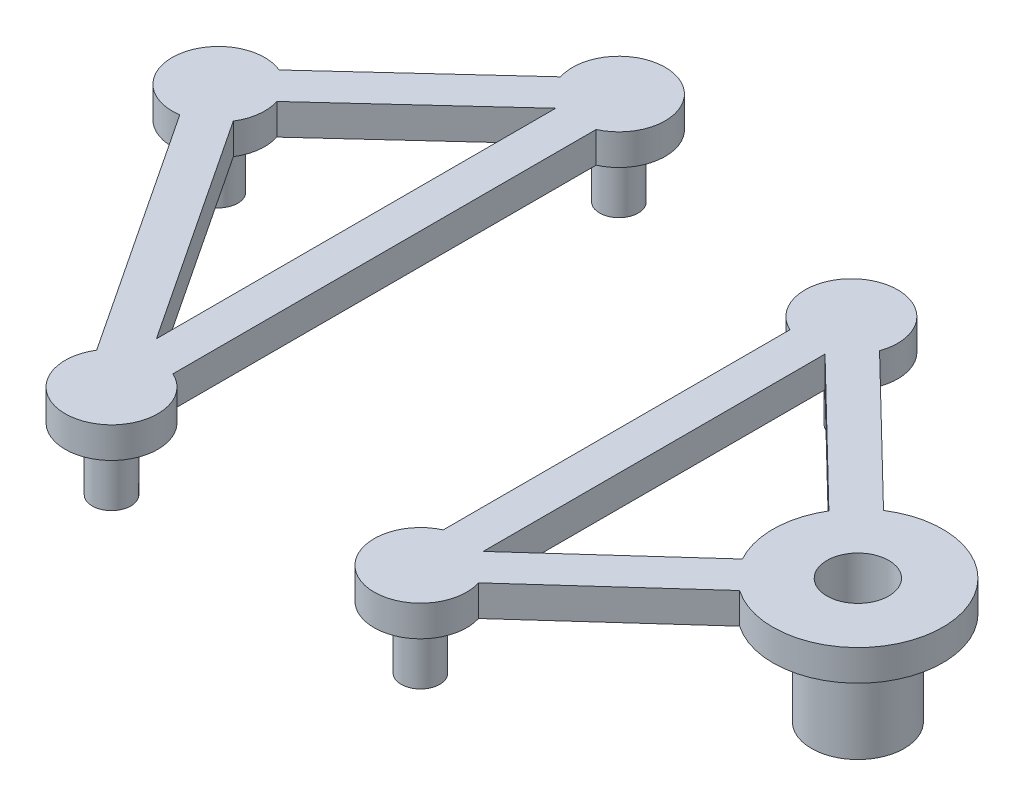
ISO-10303-21;
HEADER;
FILE_DESCRIPTION(('STEP AP214'),'2;1');
FILE_NAME('part.step','',(''),(''),'','','');
FILE_SCHEMA(('AUTOMOTIVE_DESIGN { 1 0 10303 214 1 1 1 1 }'));
ENDSEC;
DATA;
#1=APPLICATION_CONTEXT('core data for automotive mechanical design processes');
#2=APPLICATION_PROTOCOL_DEFINITION('international standard','automotive_design',2000,#1);
#3=PRODUCT_CONTEXT('',#1,'mechanical');
#4=PRODUCT('Part','Part','',(#3));
#5=PRODUCT_RELATED_PRODUCT_CATEGORY('part','',(#4));
#6=PRODUCT_DEFINITION_FORMATION('','',#4);
#7=PRODUCT_DEFINITION_CONTEXT('part definition',#1,'design');
#8=PRODUCT_DEFINITION('design','',#6,#7);
#9=PRODUCT_DEFINITION_SHAPE('','',#8);
#10=(LENGTH_UNIT() NAMED_UNIT(*) SI_UNIT(.MILLI.,.METRE.));
#11=(NAMED_UNIT(*) PLANE_ANGLE_UNIT() SI_UNIT($,.RADIAN.));
#12=(NAMED_UNIT(*) SI_UNIT($,.STERADIAN.) SOLID_ANGLE_UNIT());
#13=UNCERTAINTY_MEASURE_WITH_UNIT(LENGTH_MEASURE(1.E-05),#10,'distance_accuracy_value','');
#14=(GEOMETRIC_REPRESENTATION_CONTEXT(3) GLOBAL_UNCERTAINTY_ASSIGNED_CONTEXT((#13)) GLOBAL_UNIT_ASSIGNED_CONTEXT((#10,
#11,#12)) REPRESENTATION_CONTEXT('',''));
#15=CARTESIAN_POINT('',(0.,0.,0.));
#16=DIRECTION('',(0.,0.,1.));
#17=DIRECTION('',(1.,0.,0.));
#18=AXIS2_PLACEMENT_3D('',#15,#16,#17);
#19=CARTESIAN_POINT('',(0.,4.,0.));
#20=DIRECTION('',(0.,1.,0.));
#21=DIRECTION('',(0.,0.,1.));
#22=AXIS2_PLACEMENT_3D('',#19,#20,#21);
#23=PLANE('',#22);
#24=CARTESIAN_POINT('',(29.7602440945933,4.,-26.8763440860215));
#25=DIRECTION('',(0.,1.,0.));
#26=DIRECTION('',(0.,0.,1.));
#27=AXIS2_PLACEMENT_3D('',#24,#25,#26);
#28=CIRCLE('',#27,4.);
#29=CARTESIAN_POINT('',(29.7602440945933,4.,-22.8763440860215));
#30=VERTEX_POINT('',#29);
#31=EDGE_CURVE('E237',#30,#30,#28,.T.);
#32=ORIENTED_EDGE('',*,*,#31,.F.);
#33=EDGE_LOOP('',(#32));
#34=FACE_BOUND('',#33,.T.);
#35=CARTESIAN_POINT('',(0.,4.,0.));
#36=DIRECTION('',(0.,1.,0.));
#37=DIRECTION('',(0.,0.,1.));
#38=AXIS2_PLACEMENT_3D('',#35,#36,#37);
#39=CIRCLE('',#38,6.);
#40=CARTESIAN_POINT('',(-2.49999999999999,4.,-5.45435605731786));
#41=VERTEX_POINT('',#40);
#42=CARTESIAN_POINT('',(5.72353685435553,4.,-1.80031271640067));
#43=VERTEX_POINT('',#42);
#44=EDGE_CURVE('E185',#41,#43,#39,.T.);
#45=ORIENTED_EDGE('',*,*,#44,.T.);
#46=DIRECTION('',(0.742150725550956,0.,-0.670233019601534));
#47=VECTOR('',#46,1.);
#48=CARTESIAN_POINT('',(5.72353685435553,4.,-1.80031271640067));
#49=LINE('',#48,#47);
#50=CARTESIAN_POINT('',(23.4858022090272,4.,-17.8413355622484));
#51=VERTEX_POINT('',#50);
#52=EDGE_CURVE('E189',#43,#51,#49,.T.);
#53=ORIENTED_EDGE('',*,*,#52,.T.);
#54=CARTESIAN_POINT('',(29.7602440945933,4.,-26.8763440860215));
#55=DIRECTION('',(0.,1.,0.));
#56=DIRECTION('',(0.,0.,1.));
#57=AXIS2_PLACEMENT_3D('',#54,#55,#56);
#58=CIRCLE('',#57,11.);
#59=CARTESIAN_POINT('',(23.8208021658871,4.,-36.1350172941829));
#60=VERTEX_POINT('',#59);
#61=EDGE_CURVE('E191',#51,#60,#58,.T.);
#62=ORIENTED_EDGE('',*,*,#61,.T.);
#63=DIRECTION('',(-0.71711431553237,0.,-0.696955564192252));
#64=VECTOR('',#63,1.);
#65=CARTESIAN_POINT('',(5.65378572119396,4.,-53.7913419855975));
#66=LINE('',#65,#64);
#67=CARTESIAN_POINT('',(5.65378572119396,4.,-53.7913419855975));
#68=VERTEX_POINT('',#67);
#69=EDGE_CURVE('E193',#60,#68,#66,.T.);
#70=ORIENTED_EDGE('',*,*,#69,.T.);
#71=CARTESIAN_POINT('',(0.,4.,-55.8));
#72=DIRECTION('',(0.,1.,0.));
#73=DIRECTION('',(0.,0.,1.));
#74=AXIS2_PLACEMENT_3D('',#71,#72,#73);
#75=CIRCLE('',#74,6.);
#76=CARTESIAN_POINT('',(-2.5,4.,-50.3456439426821));
#77=VERTEX_POINT('',#76);
#78=EDGE_CURVE('E195',#68,#77,#75,.T.);
#79=ORIENTED_EDGE('',*,*,#78,.T.);
#80=DIRECTION('',(0.,0.,1.));
#81=VECTOR('',#80,1.);
#82=CARTESIAN_POINT('',(-2.5,4.,-50.3456439426821));
#83=LINE('',#82,#81);
#84=EDGE_CURVE('E197',#77,#41,#83,.T.);
#85=ORIENTED_EDGE('',*,*,#84,.T.);
#86=EDGE_LOOP('',(#45,#53,#62,#70,#79,#85));
#87=FACE_BOUND('',#86,.T.);
#88=DIRECTION('',(-0.717114315532369,0.,-0.696955564192253));
#89=VECTOR('',#88,1.);
#90=CARTESIAN_POINT('',(2.50000000000001,4.,-49.8840828043836));
#91=LINE('',#90,#89);
#92=CARTESIAN_POINT('',(20.3360243449258,4.,-32.5494457165211));
#93=VERTEX_POINT('',#92);
#94=CARTESIAN_POINT('',(2.50000000000001,4.,-49.8840828043836));
#95=VERTEX_POINT('',#94);
#96=EDGE_CURVE('E80',#93,#95,#91,.T.);
#97=ORIENTED_EDGE('',*,*,#96,.F.);
#98=CARTESIAN_POINT('',(29.7602440945933,4.,-26.8763440860215));
#99=DIRECTION('',(0.,-1.,0.));
#100=DIRECTION('',(0.,0.,1.));
#101=AXIS2_PLACEMENT_3D('',#98,#99,#100);
#102=CIRCLE('',#101,11.);
#103=CARTESIAN_POINT('',(20.1346371110196,4.,-21.5520891900031));
#104=VERTEX_POINT('',#103);
#105=EDGE_CURVE('E86',#104,#93,#102,.T.);
#106=ORIENTED_EDGE('',*,*,#105,.F.);
#107=DIRECTION('',(0.742150725550956,0.,-0.670233019601534));
#108=VECTOR('',#107,1.);
#109=CARTESIAN_POINT('',(20.1346371110196,4.,-21.5520891900031));
#110=LINE('',#109,#108);
#111=CARTESIAN_POINT('',(2.50000000000001,4.,-5.62632684338344));
#112=VERTEX_POINT('',#111);
#113=EDGE_CURVE('E137',#112,#104,#110,.T.);
#114=ORIENTED_EDGE('',*,*,#113,.F.);
#115=DIRECTION('',(0.,0.,1.));
#116=VECTOR('',#115,1.);
#117=CARTESIAN_POINT('',(2.50000000000001,4.,-5.62632684338344));
#118=LINE('',#117,#116);
#119=EDGE_CURVE('E145',#95,#112,#118,.T.);
#120=ORIENTED_EDGE('',*,*,#119,.F.);
#121=EDGE_LOOP('',(#97,#106,#114,#120));
#122=FACE_BOUND('',#121,.T.);
#123=ADVANCED_FACE('F51',(#34,#87,#122),#23,.T.);
#124=CARTESIAN_POINT('',(0.,0.,0.));
#125=DIRECTION('',(0.,1.,0.));
#126=DIRECTION('',(0.,0.,1.));
#127=AXIS2_PLACEMENT_3D('',#124,#125,#126);
#128=PLANE('',#127);
#129=CARTESIAN_POINT('',(29.7602440945933,0.,-26.8763440860215));
#130=DIRECTION('',(0.,1.,0.));
#131=DIRECTION('',(0.,0.,1.));
#132=AXIS2_PLACEMENT_3D('',#129,#130,#131);
#133=CIRCLE('',#132,6.);
#134=CARTESIAN_POINT('',(29.7602440945933,0.,-20.8763440860215));
#135=VERTEX_POINT('',#134);
#136=EDGE_CURVE('E12',#135,#135,#133,.F.);
#137=ORIENTED_EDGE('',*,*,#136,.F.);
#138=EDGE_LOOP('',(#137));
#139=FACE_BOUND('',#138,.T.);
#140=CARTESIAN_POINT('',(0.,0.,0.));
#141=DIRECTION('',(0.,1.,0.));
#142=DIRECTION('',(0.,0.,1.));
#143=AXIS2_PLACEMENT_3D('',#140,#141,#142);
#144=CIRCLE('',#143,2.5);
#145=CARTESIAN_POINT('',(0.,0.,2.5));
#146=VERTEX_POINT('',#145);
#147=EDGE_CURVE('E60',#146,#146,#144,.F.);
#148=ORIENTED_EDGE('',*,*,#147,.F.);
#149=EDGE_LOOP('',(#148));
#150=FACE_BOUND('',#149,.T.);
#151=CARTESIAN_POINT('',(0.,0.,-55.8));
#152=DIRECTION('',(0.,1.,0.));
#153=DIRECTION('',(0.,0.,1.));
#154=AXIS2_PLACEMENT_3D('',#151,#152,#153);
#155=CIRCLE('',#154,2.5);
#156=CARTESIAN_POINT('',(0.,0.,-53.3));
#157=VERTEX_POINT('',#156);
#158=EDGE_CURVE('E157',#157,#157,#155,.F.);
#159=ORIENTED_EDGE('',*,*,#158,.F.);
#160=EDGE_LOOP('',(#159));
#161=FACE_BOUND('',#160,.T.);
#162=CARTESIAN_POINT('',(0.,0.,0.));
#163=DIRECTION('',(0.,1.,0.));
#164=DIRECTION('',(0.,0.,1.));
#165=AXIS2_PLACEMENT_3D('',#162,#163,#164);
#166=CIRCLE('',#165,6.);
#167=CARTESIAN_POINT('',(-2.49999999999999,0.,-5.45435605731786));
#168=VERTEX_POINT('',#167);
#169=CARTESIAN_POINT('',(5.72353685435553,0.,-1.80031271640067));
#170=VERTEX_POINT('',#169);
#171=EDGE_CURVE('E176',#168,#170,#166,.T.);
#172=ORIENTED_EDGE('',*,*,#171,.F.);
#173=DIRECTION('',(0.,0.,1.));
#174=VECTOR('',#173,1.);
#175=CARTESIAN_POINT('',(-2.5,0.,-50.3456439426821));
#176=LINE('',#175,#174);
#177=CARTESIAN_POINT('',(-2.5,0.,-50.3456439426821));
#178=VERTEX_POINT('',#177);
#179=EDGE_CURVE('E188',#178,#168,#176,.T.);
#180=ORIENTED_EDGE('',*,*,#179,.F.);
#181=CARTESIAN_POINT('',(0.,0.,-55.8));
#182=DIRECTION('',(0.,1.,0.));
#183=DIRECTION('',(0.,0.,1.));
#184=AXIS2_PLACEMENT_3D('',#181,#182,#183);
#185=CIRCLE('',#184,6.);
#186=CARTESIAN_POINT('',(5.65378572119396,0.,-53.7913419855975));
#187=VERTEX_POINT('',#186);
#188=EDGE_CURVE('E207',#187,#178,#185,.T.);
#189=ORIENTED_EDGE('',*,*,#188,.F.);
#190=DIRECTION('',(-0.71711431553237,0.,-0.696955564192252));
#191=VECTOR('',#190,1.);
#192=CARTESIAN_POINT('',(5.65378572119396,0.,-53.7913419855975));
#193=LINE('',#192,#191);
#194=CARTESIAN_POINT('',(23.8208021658871,0.,-36.1350172941829));
#195=VERTEX_POINT('',#194);
#196=EDGE_CURVE('E205',#195,#187,#193,.T.);
#197=ORIENTED_EDGE('',*,*,#196,.F.);
#198=CARTESIAN_POINT('',(29.7602440945933,0.,-26.8763440860215));
#199=DIRECTION('',(0.,1.,0.));
#200=DIRECTION('',(0.,0.,1.));
#201=AXIS2_PLACEMENT_3D('',#198,#199,#200);
#202=CIRCLE('',#201,11.);
#203=CARTESIAN_POINT('',(23.4858022090272,0.,-17.8413355622484));
#204=VERTEX_POINT('',#203);
#205=EDGE_CURVE('E203',#204,#195,#202,.T.);
#206=ORIENTED_EDGE('',*,*,#205,.F.);
#207=DIRECTION('',(0.742150725550956,0.,-0.670233019601534));
#208=VECTOR('',#207,1.);
#209=CARTESIAN_POINT('',(5.72353685435553,0.,-1.80031271640067));
#210=LINE('',#209,#208);
#211=EDGE_CURVE('E201',#170,#204,#210,.T.);
#212=ORIENTED_EDGE('',*,*,#211,.F.);
#213=EDGE_LOOP('',(#172,#180,#189,#197,#206,#212));
#214=FACE_BOUND('',#213,.T.);
#215=CARTESIAN_POINT('',(29.7602440945933,0.,-26.8763440860215));
#216=DIRECTION('',(0.,-1.,0.));
#217=DIRECTION('',(0.,0.,1.));
#218=AXIS2_PLACEMENT_3D('',#215,#216,#217);
#219=CIRCLE('',#218,11.);
#220=CARTESIAN_POINT('',(20.1346371110196,0.,-21.5520891900031));
#221=VERTEX_POINT('',#220);
#222=CARTESIAN_POINT('',(20.3360243449258,0.,-32.5494457165211));
#223=VERTEX_POINT('',#222);
#224=EDGE_CURVE('E152',#221,#223,#219,.T.);
#225=ORIENTED_EDGE('',*,*,#224,.T.);
#226=DIRECTION('',(-0.717114315532369,0.,-0.696955564192253));
#227=VECTOR('',#226,1.);
#228=CARTESIAN_POINT('',(2.50000000000001,0.,-49.8840828043836));
#229=LINE('',#228,#227);
#230=CARTESIAN_POINT('',(2.50000000000001,0.,-49.8840828043836));
#231=VERTEX_POINT('',#230);
#232=EDGE_CURVE('E68',#223,#231,#229,.T.);
#233=ORIENTED_EDGE('',*,*,#232,.T.);
#234=DIRECTION('',(0.,0.,1.));
#235=VECTOR('',#234,1.);
#236=CARTESIAN_POINT('',(2.50000000000001,0.,-5.62632684338344));
#237=LINE('',#236,#235);
#238=CARTESIAN_POINT('',(2.50000000000001,0.,-5.62632684338344));
#239=VERTEX_POINT('',#238);
#240=EDGE_CURVE('E178',#231,#239,#237,.T.);
#241=ORIENTED_EDGE('',*,*,#240,.T.);
#242=DIRECTION('',(0.742150725550956,0.,-0.670233019601534));
#243=VECTOR('',#242,1.);
#244=CARTESIAN_POINT('',(20.1346371110196,0.,-21.5520891900031));
#245=LINE('',#244,#243);
#246=EDGE_CURVE('E139',#239,#221,#245,.T.);
#247=ORIENTED_EDGE('',*,*,#246,.T.);
#248=EDGE_LOOP('',(#225,#233,#241,#247));
#249=FACE_BOUND('',#248,.T.);
#250=ADVANCED_FACE('F164',(#139,#150,#161,#214,#249),#128,.F.);
#251=CARTESIAN_POINT('',(0.,4.,0.));
#252=DIRECTION('',(0.,-1.,0.));
#253=DIRECTION('',(0.,0.,-1.));
#254=AXIS2_PLACEMENT_3D('',#251,#252,#253);
#255=CYLINDRICAL_SURFACE('',#254,6.);
#256=ORIENTED_EDGE('',*,*,#171,.T.);
#257=DIRECTION('',(0.,-1.,0.));
#258=VECTOR('',#257,1.);
#259=CARTESIAN_POINT('',(5.72353685435553,4.,-1.80031271640067));
#260=LINE('',#259,#258);
#261=EDGE_CURVE('E224',#43,#170,#260,.T.);
#262=ORIENTED_EDGE('',*,*,#261,.F.);
#263=ORIENTED_EDGE('',*,*,#44,.F.);
#264=DIRECTION('',(0.,-1.,0.));
#265=VECTOR('',#264,1.);
#266=CARTESIAN_POINT('',(-2.49999999999999,4.,-5.45435605731786));
#267=LINE('',#266,#265);
#268=EDGE_CURVE('E199',#41,#168,#267,.T.);
#269=ORIENTED_EDGE('',*,*,#268,.T.);
#270=EDGE_LOOP('',(#256,#262,#263,#269));
#271=FACE_BOUND('',#270,.T.);
#272=ADVANCED_FACE('F167',(#271),#255,.T.);
#273=CARTESIAN_POINT('',(5.72353685435553,4.,-1.80031271640067));
#274=DIRECTION('',(-0.670233019601534,0.,-0.742150725550956));
#275=DIRECTION('',(-0.742150725550956,0.,0.670233019601534));
#276=AXIS2_PLACEMENT_3D('',#273,#274,#275);
#277=PLANE('',#276);
#278=ORIENTED_EDGE('',*,*,#211,.T.);
#279=DIRECTION('',(0.,-1.,0.));
#280=VECTOR('',#279,1.);
#281=CARTESIAN_POINT('',(23.4858022090272,4.,-17.8413355622484));
#282=LINE('',#281,#280);
#283=EDGE_CURVE('E221',#51,#204,#282,.T.);
#284=ORIENTED_EDGE('',*,*,#283,.F.);
#285=ORIENTED_EDGE('',*,*,#52,.F.);
#286=ORIENTED_EDGE('',*,*,#261,.T.);
#287=EDGE_LOOP('',(#278,#284,#285,#286));
#288=FACE_BOUND('',#287,.T.);
#289=ADVANCED_FACE('F262',(#288),#277,.F.);
#290=CARTESIAN_POINT('',(29.7602440945933,4.,-26.8763440860215));
#291=DIRECTION('',(0.,-1.,0.));
#292=DIRECTION('',(0.,0.,-1.));
#293=AXIS2_PLACEMENT_3D('',#290,#291,#292);
#294=CYLINDRICAL_SURFACE('',#293,11.);
#295=ORIENTED_EDGE('',*,*,#205,.T.);
#296=DIRECTION('',(0.,-1.,0.));
#297=VECTOR('',#296,1.);
#298=CARTESIAN_POINT('',(23.8208021658871,4.,-36.1350172941829));
#299=LINE('',#298,#297);
#300=EDGE_CURVE('E218',#60,#195,#299,.T.);
#301=ORIENTED_EDGE('',*,*,#300,.F.);
#302=ORIENTED_EDGE('',*,*,#61,.F.);
#303=ORIENTED_EDGE('',*,*,#283,.T.);
#304=EDGE_LOOP('',(#295,#301,#302,#303));
#305=FACE_BOUND('',#304,.T.);
#306=ADVANCED_FACE('F267',(#305),#294,.T.);
#307=CARTESIAN_POINT('',(5.65378572119396,4.,-53.7913419855975));
#308=DIRECTION('',(-0.696955564192252,0.,0.71711431553237));
#309=DIRECTION('',(0.71711431553237,0.,0.696955564192252));
#310=AXIS2_PLACEMENT_3D('',#307,#308,#309);
#311=PLANE('',#310);
#312=ORIENTED_EDGE('',*,*,#196,.T.);
#313=DIRECTION('',(0.,-1.,0.));
#314=VECTOR('',#313,1.);
#315=CARTESIAN_POINT('',(5.65378572119396,4.,-53.7913419855975));
#316=LINE('',#315,#314);
#317=EDGE_CURVE('E215',#68,#187,#316,.T.);
#318=ORIENTED_EDGE('',*,*,#317,.F.);
#319=ORIENTED_EDGE('',*,*,#69,.F.);
#320=ORIENTED_EDGE('',*,*,#300,.T.);
#321=EDGE_LOOP('',(#312,#318,#319,#320));
#322=FACE_BOUND('',#321,.T.);
#323=ADVANCED_FACE('F273',(#322),#311,.F.);
#324=CARTESIAN_POINT('',(0.,4.,-55.8));
#325=DIRECTION('',(0.,-1.,0.));
#326=DIRECTION('',(0.,0.,-1.));
#327=AXIS2_PLACEMENT_3D('',#324,#325,#326);
#328=CYLINDRICAL_SURFACE('',#327,6.);
#329=ORIENTED_EDGE('',*,*,#188,.T.);
#330=DIRECTION('',(0.,-1.,0.));
#331=VECTOR('',#330,1.);
#332=CARTESIAN_POINT('',(-2.5,4.,-50.3456439426821));
#333=LINE('',#332,#331);
#334=EDGE_CURVE('E212',#77,#178,#333,.T.);
#335=ORIENTED_EDGE('',*,*,#334,.F.);
#336=ORIENTED_EDGE('',*,*,#78,.F.);
#337=ORIENTED_EDGE('',*,*,#317,.T.);
#338=EDGE_LOOP('',(#329,#335,#336,#337));
#339=FACE_BOUND('',#338,.T.);
#340=ADVANCED_FACE('F277',(#339),#328,.T.);
#341=CARTESIAN_POINT('',(-2.5,4.,-50.3456439426821));
#342=DIRECTION('',(1.,0.,0.));
#343=DIRECTION('',(0.,0.,-1.));
#344=AXIS2_PLACEMENT_3D('',#341,#342,#343);
#345=PLANE('',#344);
#346=ORIENTED_EDGE('',*,*,#179,.T.);
#347=ORIENTED_EDGE('',*,*,#268,.F.);
#348=ORIENTED_EDGE('',*,*,#84,.F.);
#349=ORIENTED_EDGE('',*,*,#334,.T.);
#350=EDGE_LOOP('',(#346,#347,#348,#349));
#351=FACE_BOUND('',#350,.T.);
#352=ADVANCED_FACE('F279',(#351),#345,.F.);
#353=CARTESIAN_POINT('',(29.7602440945933,4.,-26.8763440860215));
#354=DIRECTION('',(0.,-1.,0.));
#355=DIRECTION('',(0.,0.,-1.));
#356=AXIS2_PLACEMENT_3D('',#353,#354,#355);
#357=CYLINDRICAL_SURFACE('',#356,11.);
#358=ORIENTED_EDGE('',*,*,#224,.F.);
#359=DIRECTION('',(0.,-1.,0.));
#360=VECTOR('',#359,1.);
#361=CARTESIAN_POINT('',(20.1346371110196,4.,-21.5520891900031));
#362=LINE('',#361,#360);
#363=EDGE_CURVE('E141',#104,#221,#362,.T.);
#364=ORIENTED_EDGE('',*,*,#363,.F.);
#365=ORIENTED_EDGE('',*,*,#105,.T.);
#366=DIRECTION('',(0.,-1.,0.));
#367=VECTOR('',#366,1.);
#368=CARTESIAN_POINT('',(20.3360243449258,4.,-32.5494457165211));
#369=LINE('',#368,#367);
#370=EDGE_CURVE('E183',#93,#223,#369,.T.);
#371=ORIENTED_EDGE('',*,*,#370,.T.);
#372=EDGE_LOOP('',(#358,#364,#365,#371));
#373=FACE_BOUND('',#372,.T.);
#374=ADVANCED_FACE('F281',(#373),#357,.T.);
#375=CARTESIAN_POINT('',(2.50000000000001,4.,-49.8840828043836));
#376=DIRECTION('',(-0.696955564192253,0.,0.717114315532369));
#377=DIRECTION('',(0.717114315532369,0.,0.696955564192253));
#378=AXIS2_PLACEMENT_3D('',#375,#376,#377);
#379=PLANE('',#378);
#380=ORIENTED_EDGE('',*,*,#232,.F.);
#381=ORIENTED_EDGE('',*,*,#370,.F.);
#382=ORIENTED_EDGE('',*,*,#96,.T.);
#383=DIRECTION('',(0.,-1.,0.));
#384=VECTOR('',#383,1.);
#385=CARTESIAN_POINT('',(2.50000000000001,4.,-49.8840828043836));
#386=LINE('',#385,#384);
#387=EDGE_CURVE('E142',#95,#231,#386,.T.);
#388=ORIENTED_EDGE('',*,*,#387,.T.);
#389=EDGE_LOOP('',(#380,#381,#382,#388));
#390=FACE_BOUND('',#389,.T.);
#391=ADVANCED_FACE('F287',(#390),#379,.T.);
#392=CARTESIAN_POINT('',(2.50000000000001,4.,-5.62632684338344));
#393=DIRECTION('',(1.,0.,0.));
#394=DIRECTION('',(0.,0.,-1.));
#395=AXIS2_PLACEMENT_3D('',#392,#393,#394);
#396=PLANE('',#395);
#397=ORIENTED_EDGE('',*,*,#240,.F.);
#398=ORIENTED_EDGE('',*,*,#387,.F.);
#399=ORIENTED_EDGE('',*,*,#119,.T.);
#400=DIRECTION('',(0.,-1.,0.));
#401=VECTOR('',#400,1.);
#402=CARTESIAN_POINT('',(2.50000000000001,4.,-5.62632684338344));
#403=LINE('',#402,#401);
#404=EDGE_CURVE('E92',#112,#239,#403,.T.);
#405=ORIENTED_EDGE('',*,*,#404,.T.);
#406=EDGE_LOOP('',(#397,#398,#399,#405));
#407=FACE_BOUND('',#406,.T.);
#408=ADVANCED_FACE('F146',(#407),#396,.T.);
#409=CARTESIAN_POINT('',(20.1346371110196,4.,-21.5520891900031));
#410=DIRECTION('',(-0.670233019601534,0.,-0.742150725550956));
#411=DIRECTION('',(-0.742150725550956,0.,0.670233019601534));
#412=AXIS2_PLACEMENT_3D('',#409,#410,#411);
#413=PLANE('',#412);
#414=ORIENTED_EDGE('',*,*,#246,.F.);
#415=ORIENTED_EDGE('',*,*,#404,.F.);
#416=ORIENTED_EDGE('',*,*,#113,.T.);
#417=ORIENTED_EDGE('',*,*,#363,.T.);
#418=EDGE_LOOP('',(#414,#415,#416,#417));
#419=FACE_BOUND('',#418,.T.);
#420=ADVANCED_FACE('F53',(#419),#413,.T.);
#421=CARTESIAN_POINT('',(0.,-8.1,-55.8));
#422=DIRECTION('',(0.,1.,0.));
#423=DIRECTION('',(0.,0.,1.));
#424=AXIS2_PLACEMENT_3D('',#421,#422,#423);
#425=CYLINDRICAL_SURFACE('',#424,2.5);
#426=CARTESIAN_POINT('',(0.,-8.1,-55.8));
#427=DIRECTION('',(0.,-1.,0.));
#428=DIRECTION('',(0.,0.,-1.));
#429=AXIS2_PLACEMENT_3D('',#426,#427,#428);
#430=CIRCLE('',#429,2.5);
#431=CARTESIAN_POINT('',(0.,-8.1,-58.3));
#432=VERTEX_POINT('',#431);
#433=EDGE_CURVE('E228',#432,#432,#430,.T.);
#434=ORIENTED_EDGE('',*,*,#433,.F.);
#435=EDGE_LOOP('',(#434));
#436=FACE_BOUND('',#435,.T.);
#437=ORIENTED_EDGE('',*,*,#158,.T.);
#438=EDGE_LOOP('',(#437));
#439=FACE_BOUND('',#438,.T.);
#440=ADVANCED_FACE('F297',(#436,#439),#425,.T.);
#441=CARTESIAN_POINT('',(0.,-8.1,-55.8));
#442=DIRECTION('',(0.,-1.,0.));
#443=DIRECTION('',(0.,0.,-1.));
#444=AXIS2_PLACEMENT_3D('',#441,#442,#443);
#445=PLANE('',#444);
#446=ORIENTED_EDGE('',*,*,#433,.T.);
#447=EDGE_LOOP('',(#446));
#448=FACE_BOUND('',#447,.T.);
#449=ADVANCED_FACE('F301',(#448),#445,.T.);
#450=CARTESIAN_POINT('',(0.,-8.1,0.));
#451=DIRECTION('',(0.,1.,0.));
#452=DIRECTION('',(0.,0.,1.));
#453=AXIS2_PLACEMENT_3D('',#450,#451,#452);
#454=CYLINDRICAL_SURFACE('',#453,2.5);
#455=CARTESIAN_POINT('',(0.,-8.1,0.));
#456=DIRECTION('',(0.,-1.,0.));
#457=DIRECTION('',(0.,0.,-1.));
#458=AXIS2_PLACEMENT_3D('',#455,#456,#457);
#459=CIRCLE('',#458,2.5);
#460=CARTESIAN_POINT('',(0.,-8.1,-2.5));
#461=VERTEX_POINT('',#460);
#462=EDGE_CURVE('E227',#461,#461,#459,.T.);
#463=ORIENTED_EDGE('',*,*,#462,.F.);
#464=EDGE_LOOP('',(#463));
#465=FACE_BOUND('',#464,.T.);
#466=ORIENTED_EDGE('',*,*,#147,.T.);
#467=EDGE_LOOP('',(#466));
#468=FACE_BOUND('',#467,.T.);
#469=ADVANCED_FACE('F162',(#465,#468),#454,.T.);
#470=CARTESIAN_POINT('',(0.,-8.1,0.));
#471=DIRECTION('',(0.,-1.,0.));
#472=DIRECTION('',(0.,0.,-1.));
#473=AXIS2_PLACEMENT_3D('',#470,#471,#472);
#474=PLANE('',#473);
#475=ORIENTED_EDGE('',*,*,#462,.T.);
#476=EDGE_LOOP('',(#475));
#477=FACE_BOUND('',#476,.T.);
#478=ADVANCED_FACE('F373',(#477),#474,.T.);
#479=CARTESIAN_POINT('',(29.7602440945933,-12.1,-26.8763440860215));
#480=DIRECTION('',(0.,1.,0.));
#481=DIRECTION('',(0.,0.,1.));
#482=AXIS2_PLACEMENT_3D('',#479,#480,#481);
#483=CYLINDRICAL_SURFACE('',#482,6.);
#484=CARTESIAN_POINT('',(29.7602440945933,-12.1,-26.8763440860215));
#485=DIRECTION('',(0.,-1.,0.));
#486=DIRECTION('',(0.,0.,-1.));
#487=AXIS2_PLACEMENT_3D('',#484,#485,#486);
#488=CIRCLE('',#487,6.);
#489=CARTESIAN_POINT('',(29.7602440945933,-12.1,-32.8763440860215));
#490=VERTEX_POINT('',#489);
#491=EDGE_CURVE('E231',#490,#490,#488,.T.);
#492=ORIENTED_EDGE('',*,*,#491,.F.);
#493=EDGE_LOOP('',(#492));
#494=FACE_BOUND('',#493,.T.);
#495=ORIENTED_EDGE('',*,*,#136,.T.);
#496=EDGE_LOOP('',(#495));
#497=FACE_BOUND('',#496,.T.);
#498=ADVANCED_FACE('F382',(#494,#497),#483,.T.);
#499=CARTESIAN_POINT('',(29.7602440945933,-12.1,-26.8763440860215));
#500=DIRECTION('',(0.,-1.,0.));
#501=DIRECTION('',(0.,0.,-1.));
#502=AXIS2_PLACEMENT_3D('',#499,#500,#501);
#503=PLANE('',#502);
#504=CARTESIAN_POINT('',(29.7602440945933,-12.1,-26.8763440860215));
#505=DIRECTION('',(0.,1.,0.));
#506=DIRECTION('',(0.,0.,1.));
#507=AXIS2_PLACEMENT_3D('',#504,#505,#506);
#508=CIRCLE('',#507,4.);
#509=CARTESIAN_POINT('',(29.7602440945933,-12.1,-22.8763440860215));
#510=VERTEX_POINT('',#509);
#511=EDGE_CURVE('E236',#510,#510,#508,.T.);
#512=ORIENTED_EDGE('',*,*,#511,.T.);
#513=EDGE_LOOP('',(#512));
#514=FACE_BOUND('',#513,.T.);
#515=ORIENTED_EDGE('',*,*,#491,.T.);
#516=EDGE_LOOP('',(#515));
#517=FACE_BOUND('',#516,.T.);
#518=ADVANCED_FACE('F243',(#514,#517),#503,.T.);
#519=CARTESIAN_POINT('',(29.7602440945933,-12.1,-26.8763440860215));
#520=DIRECTION('',(0.,1.,0.));
#521=DIRECTION('',(0.,0.,1.));
#522=AXIS2_PLACEMENT_3D('',#519,#520,#521);
#523=CYLINDRICAL_SURFACE('',#522,4.);
#524=ORIENTED_EDGE('',*,*,#511,.F.);
#525=EDGE_LOOP('',(#524));
#526=FACE_BOUND('',#525,.T.);
#527=ORIENTED_EDGE('',*,*,#31,.T.);
#528=EDGE_LOOP('',(#527));
#529=FACE_BOUND('',#528,.T.);
#530=ADVANCED_FACE('F246',(#526,#529),#523,.F.);
#531=CLOSED_SHELL('',(#123,#250,#272,#289,#306,#323,#340,#352,#374,#391,#408,#420,#440,#449,
#469,#478,#498,#518,#530));
#532=MANIFOLD_SOLID_BREP('B2',#531);
#533=CARTESIAN_POINT('',(-67.0271654386819,0.,-40.8721461187215));
#534=DIRECTION('',(0.,-1.,0.));
#535=DIRECTION('',(0.,0.,-1.));
#536=AXIS2_PLACEMENT_3D('',#533,#534,#535);
#537=PLANE('',#536);
#538=CARTESIAN_POINT('',(-40.,0.,0.));
#539=DIRECTION('',(0.,-1.,0.));
#540=DIRECTION('',(0.,0.,-1.));
#541=AXIS2_PLACEMENT_3D('',#538,#539,#540);
#542=CIRCLE('',#541,2.5);
#543=CARTESIAN_POINT('',(-40.,0.,-2.5));
#544=VERTEX_POINT('',#543);
#545=EDGE_CURVE('E686',#544,#544,#542,.T.);
#546=ORIENTED_EDGE('',*,*,#545,.F.);
#547=EDGE_LOOP('',(#546));
#548=FACE_BOUND('',#547,.T.);
#549=CARTESIAN_POINT('',(-40.,0.,-65.7));
#550=DIRECTION('',(0.,-1.,0.));
#551=DIRECTION('',(0.,0.,-1.));
#552=AXIS2_PLACEMENT_3D('',#549,#550,#551);
#553=CIRCLE('',#552,2.5);
#554=CARTESIAN_POINT('',(-40.,0.,-68.2));
#555=VERTEX_POINT('',#554);
#556=EDGE_CURVE('E689',#555,#555,#553,.T.);
#557=ORIENTED_EDGE('',*,*,#556,.F.);
#558=EDGE_LOOP('',(#557));
#559=FACE_BOUND('',#558,.T.);
#560=CARTESIAN_POINT('',(-67.0271654386819,0.,-40.8721461187215));
#561=DIRECTION('',(0.,1.,0.));
#562=DIRECTION('',(0.,0.,-1.));
#563=AXIS2_PLACEMENT_3D('',#560,#561,#562);
#564=CIRCLE('',#563,5.99999999999999);
#565=CARTESIAN_POINT('',(-64.7016572964637,0.,-46.4031507182926));
#566=VERTEX_POINT('',#565);
#567=CARTESIAN_POINT('',(-66.1039936381553,0.,-34.9435920094371));
#568=VERTEX_POINT('',#567);
#569=EDGE_CURVE('E538',#566,#568,#564,.T.);
#570=ORIENTED_EDGE('',*,*,#569,.F.);
#571=DIRECTION('',(-0.736435025577164,0.,0.67650828014383));
#572=VECTOR('',#571,1.);
#573=CARTESIAN_POINT('',(-64.7016572964637,0.,-46.4031507182926));
#574=LINE('',#573,#572);
#575=CARTESIAN_POINT('',(-45.7080495429374,0.,-63.8511705283147));
#576=VERTEX_POINT('',#575);
#577=EDGE_CURVE('E565',#576,#566,#574,.T.);
#578=ORIENTED_EDGE('',*,*,#577,.F.);
#579=CARTESIAN_POINT('',(-40.,0.,-65.7));
#580=DIRECTION('',(0.,1.,0.));
#581=DIRECTION('',(0.,0.,-1.));
#582=AXIS2_PLACEMENT_3D('',#579,#580,#581);
#583=CIRCLE('',#582,6.);
#584=CARTESIAN_POINT('',(-37.5,0.,-60.2456439426822));
#585=VERTEX_POINT('',#584);
#586=EDGE_CURVE('E584',#585,#576,#583,.T.);
#587=ORIENTED_EDGE('',*,*,#586,.F.);
#588=DIRECTION('',(0.,0.,-1.));
#589=VECTOR('',#588,1.);
#590=CARTESIAN_POINT('',(-37.5,0.,-60.2456439426822));
#591=LINE('',#590,#589);
#592=CARTESIAN_POINT('',(-37.5,0.,-5.45435605731785));
#593=VERTEX_POINT('',#592);
#594=EDGE_CURVE('E582',#593,#585,#591,.T.);
#595=ORIENTED_EDGE('',*,*,#594,.F.);
#596=CARTESIAN_POINT('',(-40.,0.,0.));
#597=DIRECTION('',(0.,1.,0.));
#598=DIRECTION('',(0.,0.,1.));
#599=AXIS2_PLACEMENT_3D('',#596,#597,#598);
#600=CIRCLE('',#599,6.);
#601=CARTESIAN_POINT('',(-45.0937989554982,0.,-3.17068008492905));
#602=VERTEX_POINT('',#601);
#603=EDGE_CURVE('E580',#602,#593,#600,.T.);
#604=ORIENTED_EDGE('',*,*,#603,.F.);
#605=DIRECTION('',(0.551574804871059,0.,0.834125430994316));
#606=VECTOR('',#605,1.);
#607=CARTESIAN_POINT('',(-66.1039936381553,0.,-34.9435920094371));
#608=LINE('',#607,#606);
#609=EDGE_CURVE('E578',#568,#602,#608,.T.);
#610=ORIENTED_EDGE('',*,*,#609,.F.);
#611=EDGE_LOOP('',(#570,#578,#587,#595,#604,#610));
#612=FACE_BOUND('',#611,.T.);
#613=DIRECTION('',(0.55157480487106,0.,0.834125430994315));
#614=VECTOR('',#613,1.);
#615=CARTESIAN_POINT('',(-42.5,0.,-8.31313094251591));
#616=LINE('',#615,#614);
#617=CARTESIAN_POINT('',(-61.9333664831838,0.,-37.7014660337924));
#618=VERTEX_POINT('',#617);
#619=CARTESIAN_POINT('',(-42.5,0.,-8.31313094251591));
#620=VERTEX_POINT('',#619);
#621=EDGE_CURVE('E531',#618,#620,#616,.T.);
#622=ORIENTED_EDGE('',*,*,#621,.T.);
#623=DIRECTION('',(0.,0.,-1.));
#624=VECTOR('',#623,1.);
#625=CARTESIAN_POINT('',(-42.5,0.,-60.0087026624314));
#626=LINE('',#625,#624);
#627=CARTESIAN_POINT('',(-42.5,0.,-60.0087026624314));
#628=VERTEX_POINT('',#627);
#629=EDGE_CURVE('E468',#620,#628,#626,.T.);
#630=ORIENTED_EDGE('',*,*,#629,.T.);
#631=DIRECTION('',(-0.736435025577164,0.,0.67650828014383));
#632=VECTOR('',#631,1.);
#633=CARTESIAN_POINT('',(-61.3191158957445,0.,-42.7209755904067));
#634=LINE('',#633,#632);
#635=CARTESIAN_POINT('',(-61.3191158957445,0.,-42.7209755904067));
#636=VERTEX_POINT('',#635);
#637=EDGE_CURVE('E537',#628,#636,#634,.T.);
#638=ORIENTED_EDGE('',*,*,#637,.T.);
#639=CARTESIAN_POINT('',(-67.0271654386819,0.,-40.8721461187215));
#640=DIRECTION('',(0.,-1.,0.));
#641=DIRECTION('',(0.,0.,-1.));
#642=AXIS2_PLACEMENT_3D('',#639,#640,#641);
#643=CIRCLE('',#642,5.99999999999999);
#644=EDGE_CURVE('E553',#636,#618,#643,.T.);
#645=ORIENTED_EDGE('',*,*,#644,.T.);
#646=EDGE_LOOP('',(#622,#630,#638,#645));
#647=FACE_BOUND('',#646,.T.);
#648=CARTESIAN_POINT('',(-67.0271654386819,0.,-40.8721461187215));
#649=DIRECTION('',(0.,-1.,0.));
#650=DIRECTION('',(0.,0.,-1.));
#651=AXIS2_PLACEMENT_3D('',#648,#649,#650);
#652=CIRCLE('',#651,2.50000000000001);
#653=CARTESIAN_POINT('',(-67.0271654386819,0.,-43.3721461187215));
#654=VERTEX_POINT('',#653);
#655=EDGE_CURVE('E49',#654,#654,#652,.T.);
#656=ORIENTED_EDGE('',*,*,#655,.F.);
#657=EDGE_LOOP('',(#656));
#658=FACE_BOUND('',#657,.T.);
#659=ADVANCED_FACE('F444',(#548,#559,#612,#647,#658),#537,.T.);
#660=CARTESIAN_POINT('',(-67.0271654386819,4.,-40.8721461187215));
#661=DIRECTION('',(0.,-1.,0.));
#662=DIRECTION('',(0.,0.,-1.));
#663=AXIS2_PLACEMENT_3D('',#660,#661,#662);
#664=PLANE('',#663);
#665=CARTESIAN_POINT('',(-67.0271654386819,4.,-40.8721461187215));
#666=DIRECTION('',(0.,1.,0.));
#667=DIRECTION('',(0.,0.,-1.));
#668=AXIS2_PLACEMENT_3D('',#665,#666,#667);
#669=CIRCLE('',#668,5.99999999999999);
#670=CARTESIAN_POINT('',(-64.7016572964637,4.,-46.4031507182926));
#671=VERTEX_POINT('',#670);
#672=CARTESIAN_POINT('',(-66.1039936381553,4.,-34.9435920094371));
#673=VERTEX_POINT('',#672);
#674=EDGE_CURVE('E561',#671,#673,#669,.T.);
#675=ORIENTED_EDGE('',*,*,#674,.T.);
#676=DIRECTION('',(0.551574804871059,0.,0.834125430994316));
#677=VECTOR('',#676,1.);
#678=CARTESIAN_POINT('',(-66.1039936381553,4.,-34.9435920094371));
#679=LINE('',#678,#677);
#680=CARTESIAN_POINT('',(-45.0937989554982,4.,-3.17068008492905));
#681=VERTEX_POINT('',#680);
#682=EDGE_CURVE('E564',#673,#681,#679,.T.);
#683=ORIENTED_EDGE('',*,*,#682,.T.);
#684=CARTESIAN_POINT('',(-40.,4.,0.));
#685=DIRECTION('',(0.,1.,0.));
#686=DIRECTION('',(0.,0.,1.));
#687=AXIS2_PLACEMENT_3D('',#684,#685,#686);
#688=CIRCLE('',#687,6.);
#689=CARTESIAN_POINT('',(-37.5,4.,-5.45435605731785));
#690=VERTEX_POINT('',#689);
#691=EDGE_CURVE('E567',#681,#690,#688,.T.);
#692=ORIENTED_EDGE('',*,*,#691,.T.);
#693=DIRECTION('',(0.,0.,-1.));
#694=VECTOR('',#693,1.);
#695=CARTESIAN_POINT('',(-37.5,4.,-60.2456439426822));
#696=LINE('',#695,#694);
#697=CARTESIAN_POINT('',(-37.5,4.,-60.2456439426822));
#698=VERTEX_POINT('',#697);
#699=EDGE_CURVE('E569',#690,#698,#696,.T.);
#700=ORIENTED_EDGE('',*,*,#699,.T.);
#701=CARTESIAN_POINT('',(-40.,4.,-65.7));
#702=DIRECTION('',(0.,1.,0.));
#703=DIRECTION('',(0.,0.,-1.));
#704=AXIS2_PLACEMENT_3D('',#701,#702,#703);
#705=CIRCLE('',#704,6.);
#706=CARTESIAN_POINT('',(-45.7080495429374,4.,-63.8511705283147));
#707=VERTEX_POINT('',#706);
#708=EDGE_CURVE('E571',#698,#707,#705,.T.);
#709=ORIENTED_EDGE('',*,*,#708,.T.);
#710=DIRECTION('',(-0.736435025577164,0.,0.67650828014383));
#711=VECTOR('',#710,1.);
#712=CARTESIAN_POINT('',(-64.7016572964637,4.,-46.4031507182926));
#713=LINE('',#712,#711);
#714=EDGE_CURVE('E573',#707,#671,#713,.T.);
#715=ORIENTED_EDGE('',*,*,#714,.T.);
#716=EDGE_LOOP('',(#675,#683,#692,#700,#709,#715));
#717=FACE_BOUND('',#716,.T.);
#718=DIRECTION('',(0.,0.,-1.));
#719=VECTOR('',#718,1.);
#720=CARTESIAN_POINT('',(-42.5,4.,-60.0087026624314));
#721=LINE('',#720,#719);
#722=CARTESIAN_POINT('',(-42.5,4.,-8.31313094251591));
#723=VERTEX_POINT('',#722);
#724=CARTESIAN_POINT('',(-42.5,4.,-60.0087026624314));
#725=VERTEX_POINT('',#724);
#726=EDGE_CURVE('E522',#723,#725,#721,.T.);
#727=ORIENTED_EDGE('',*,*,#726,.F.);
#728=DIRECTION('',(0.55157480487106,0.,0.834125430994315));
#729=VECTOR('',#728,1.);
#730=CARTESIAN_POINT('',(-42.5,4.,-8.31313094251591));
#731=LINE('',#730,#729);
#732=CARTESIAN_POINT('',(-61.9333664831838,4.,-37.7014660337924));
#733=VERTEX_POINT('',#732);
#734=EDGE_CURVE('E545',#733,#723,#731,.T.);
#735=ORIENTED_EDGE('',*,*,#734,.F.);
#736=CARTESIAN_POINT('',(-67.0271654386819,4.,-40.8721461187215));
#737=DIRECTION('',(0.,-1.,0.));
#738=DIRECTION('',(0.,0.,-1.));
#739=AXIS2_PLACEMENT_3D('',#736,#737,#738);
#740=CIRCLE('',#739,5.99999999999999);
#741=CARTESIAN_POINT('',(-61.3191158957445,4.,-42.7209755904067));
#742=VERTEX_POINT('',#741);
#743=EDGE_CURVE('E543',#742,#733,#740,.T.);
#744=ORIENTED_EDGE('',*,*,#743,.F.);
#745=DIRECTION('',(-0.736435025577164,0.,0.67650828014383));
#746=VECTOR('',#745,1.);
#747=CARTESIAN_POINT('',(-61.3191158957445,4.,-42.7209755904067));
#748=LINE('',#747,#746);
#749=EDGE_CURVE('E530',#725,#742,#748,.T.);
#750=ORIENTED_EDGE('',*,*,#749,.F.);
#751=EDGE_LOOP('',(#727,#735,#744,#750));
#752=FACE_BOUND('',#751,.T.);
#753=ADVANCED_FACE('F542',(#717,#752),#664,.F.);
#754=CARTESIAN_POINT('',(-67.0271654386819,4.,-40.8721461187215));
#755=DIRECTION('',(0.,-1.,0.));
#756=DIRECTION('',(0.,0.,-1.));
#757=AXIS2_PLACEMENT_3D('',#754,#755,#756);
#758=CYLINDRICAL_SURFACE('',#757,5.99999999999999);
#759=ORIENTED_EDGE('',*,*,#569,.T.);
#760=DIRECTION('',(0.,-1.,0.));
#761=VECTOR('',#760,1.);
#762=CARTESIAN_POINT('',(-66.1039936381553,4.,-34.9435920094371));
#763=LINE('',#762,#761);
#764=EDGE_CURVE('E448',#673,#568,#763,.T.);
#765=ORIENTED_EDGE('',*,*,#764,.F.);
#766=ORIENTED_EDGE('',*,*,#674,.F.);
#767=DIRECTION('',(0.,-1.,0.));
#768=VECTOR('',#767,1.);
#769=CARTESIAN_POINT('',(-64.7016572964637,4.,-46.4031507182926));
#770=LINE('',#769,#768);
#771=EDGE_CURVE('E575',#671,#566,#770,.T.);
#772=ORIENTED_EDGE('',*,*,#771,.T.);
#773=EDGE_LOOP('',(#759,#765,#766,#772));
#774=FACE_BOUND('',#773,.T.);
#775=ADVANCED_FACE('F446',(#774),#758,.T.);
#776=CARTESIAN_POINT('',(-66.1039936381553,4.,-34.9435920094371));
#777=DIRECTION('',(0.834125430994316,0.,-0.551574804871059));
#778=DIRECTION('',(-0.551574804871059,0.,-0.834125430994316));
#779=AXIS2_PLACEMENT_3D('',#776,#777,#778);
#780=PLANE('',#779);
#781=ORIENTED_EDGE('',*,*,#609,.T.);
#782=DIRECTION('',(0.,-1.,0.));
#783=VECTOR('',#782,1.);
#784=CARTESIAN_POINT('',(-45.0937989554982,4.,-3.17068008492905));
#785=LINE('',#784,#783);
#786=EDGE_CURVE('E597',#681,#602,#785,.T.);
#787=ORIENTED_EDGE('',*,*,#786,.F.);
#788=ORIENTED_EDGE('',*,*,#682,.F.);
#789=ORIENTED_EDGE('',*,*,#764,.T.);
#790=EDGE_LOOP('',(#781,#787,#788,#789));
#791=FACE_BOUND('',#790,.T.);
#792=ADVANCED_FACE('F606',(#791),#780,.F.);
#793=CARTESIAN_POINT('',(-40.,4.,0.));
#794=DIRECTION('',(0.,-1.,0.));
#795=DIRECTION('',(0.,0.,-1.));
#796=AXIS2_PLACEMENT_3D('',#793,#794,#795);
#797=CYLINDRICAL_SURFACE('',#796,6.);
#798=ORIENTED_EDGE('',*,*,#603,.T.);
#799=DIRECTION('',(0.,-1.,0.));
#800=VECTOR('',#799,1.);
#801=CARTESIAN_POINT('',(-37.5,4.,-5.45435605731785));
#802=LINE('',#801,#800);
#803=EDGE_CURVE('E595',#690,#593,#802,.T.);
#804=ORIENTED_EDGE('',*,*,#803,.F.);
#805=ORIENTED_EDGE('',*,*,#691,.F.);
#806=ORIENTED_EDGE('',*,*,#786,.T.);
#807=EDGE_LOOP('',(#798,#804,#805,#806));
#808=FACE_BOUND('',#807,.T.);
#809=ADVANCED_FACE('F617',(#808),#797,.T.);
#810=CARTESIAN_POINT('',(-37.5,4.,-60.2456439426822));
#811=DIRECTION('',(-1.,0.,0.));
#812=DIRECTION('',(0.,0.,1.));
#813=AXIS2_PLACEMENT_3D('',#810,#811,#812);
#814=PLANE('',#813);
#815=ORIENTED_EDGE('',*,*,#594,.T.);
#816=DIRECTION('',(0.,-1.,0.));
#817=VECTOR('',#816,1.);
#818=CARTESIAN_POINT('',(-37.5,4.,-60.2456439426822));
#819=LINE('',#818,#817);
#820=EDGE_CURVE('E592',#698,#585,#819,.T.);
#821=ORIENTED_EDGE('',*,*,#820,.F.);
#822=ORIENTED_EDGE('',*,*,#699,.F.);
#823=ORIENTED_EDGE('',*,*,#803,.T.);
#824=EDGE_LOOP('',(#815,#821,#822,#823));
#825=FACE_BOUND('',#824,.T.);
#826=ADVANCED_FACE('F620',(#825),#814,.F.);
#827=CARTESIAN_POINT('',(-40.,4.,-65.7));
#828=DIRECTION('',(0.,-1.,0.));
#829=DIRECTION('',(0.,0.,-1.));
#830=AXIS2_PLACEMENT_3D('',#827,#828,#829);
#831=CYLINDRICAL_SURFACE('',#830,6.);
#832=ORIENTED_EDGE('',*,*,#586,.T.);
#833=DIRECTION('',(0.,-1.,0.));
#834=VECTOR('',#833,1.);
#835=CARTESIAN_POINT('',(-45.7080495429374,4.,-63.8511705283147));
#836=LINE('',#835,#834);
#837=EDGE_CURVE('E589',#707,#576,#836,.T.);
#838=ORIENTED_EDGE('',*,*,#837,.F.);
#839=ORIENTED_EDGE('',*,*,#708,.F.);
#840=ORIENTED_EDGE('',*,*,#820,.T.);
#841=EDGE_LOOP('',(#832,#838,#839,#840));
#842=FACE_BOUND('',#841,.T.);
#843=ADVANCED_FACE('F629',(#842),#831,.T.);
#844=CARTESIAN_POINT('',(-64.7016572964637,4.,-46.4031507182926));
#845=DIRECTION('',(0.67650828014383,0.,0.736435025577164));
#846=DIRECTION('',(0.736435025577164,0.,-0.67650828014383));
#847=AXIS2_PLACEMENT_3D('',#844,#845,#846);
#848=PLANE('',#847);
#849=ORIENTED_EDGE('',*,*,#577,.T.);
#850=ORIENTED_EDGE('',*,*,#771,.F.);
#851=ORIENTED_EDGE('',*,*,#714,.F.);
#852=ORIENTED_EDGE('',*,*,#837,.T.);
#853=EDGE_LOOP('',(#849,#850,#851,#852));
#854=FACE_BOUND('',#853,.T.);
#855=ADVANCED_FACE('F627',(#854),#848,.F.);
#856=CARTESIAN_POINT('',(-42.5,4.,-60.0087026624314));
#857=DIRECTION('',(-1.,0.,0.));
#858=DIRECTION('',(0.,0.,1.));
#859=AXIS2_PLACEMENT_3D('',#856,#857,#858);
#860=PLANE('',#859);
#861=ORIENTED_EDGE('',*,*,#629,.F.);
#862=DIRECTION('',(0.,-1.,0.));
#863=VECTOR('',#862,1.);
#864=CARTESIAN_POINT('',(-42.5,4.,-8.31313094251591));
#865=LINE('',#864,#863);
#866=EDGE_CURVE('E526',#723,#620,#865,.T.);
#867=ORIENTED_EDGE('',*,*,#866,.F.);
#868=ORIENTED_EDGE('',*,*,#726,.T.);
#869=DIRECTION('',(0.,-1.,0.));
#870=VECTOR('',#869,1.);
#871=CARTESIAN_POINT('',(-42.5,4.,-60.0087026624314));
#872=LINE('',#871,#870);
#873=EDGE_CURVE('E525',#725,#628,#872,.T.);
#874=ORIENTED_EDGE('',*,*,#873,.T.);
#875=EDGE_LOOP('',(#861,#867,#868,#874));
#876=FACE_BOUND('',#875,.T.);
#877=ADVANCED_FACE('F524',(#876),#860,.T.);
#878=CARTESIAN_POINT('',(-61.3191158957445,4.,-42.7209755904067));
#879=DIRECTION('',(0.67650828014383,0.,0.736435025577164));
#880=DIRECTION('',(0.736435025577164,0.,-0.67650828014383));
#881=AXIS2_PLACEMENT_3D('',#878,#879,#880);
#882=PLANE('',#881);
#883=ORIENTED_EDGE('',*,*,#637,.F.);
#884=ORIENTED_EDGE('',*,*,#873,.F.);
#885=ORIENTED_EDGE('',*,*,#749,.T.);
#886=DIRECTION('',(0.,-1.,0.));
#887=VECTOR('',#886,1.);
#888=CARTESIAN_POINT('',(-61.3191158957445,4.,-42.7209755904067));
#889=LINE('',#888,#887);
#890=EDGE_CURVE('E539',#742,#636,#889,.T.);
#891=ORIENTED_EDGE('',*,*,#890,.T.);
#892=EDGE_LOOP('',(#883,#884,#885,#891));
#893=FACE_BOUND('',#892,.T.);
#894=ADVANCED_FACE('F534',(#893),#882,.T.);
#895=CARTESIAN_POINT('',(-67.0271654386819,4.,-40.8721461187215));
#896=DIRECTION('',(0.,-1.,0.));
#897=DIRECTION('',(0.,0.,-1.));
#898=AXIS2_PLACEMENT_3D('',#895,#896,#897);
#899=CYLINDRICAL_SURFACE('',#898,5.99999999999999);
#900=ORIENTED_EDGE('',*,*,#644,.F.);
#901=ORIENTED_EDGE('',*,*,#890,.F.);
#902=ORIENTED_EDGE('',*,*,#743,.T.);
#903=DIRECTION('',(0.,-1.,0.));
#904=VECTOR('',#903,1.);
#905=CARTESIAN_POINT('',(-61.9333664831838,4.,-37.7014660337924));
#906=LINE('',#905,#904);
#907=EDGE_CURVE('E460',#733,#618,#906,.T.);
#908=ORIENTED_EDGE('',*,*,#907,.T.);
#909=EDGE_LOOP('',(#900,#901,#902,#908));
#910=FACE_BOUND('',#909,.T.);
#911=ADVANCED_FACE('F654',(#910),#899,.T.);
#912=CARTESIAN_POINT('',(-42.5,4.,-8.31313094251591));
#913=DIRECTION('',(0.834125430994315,0.,-0.55157480487106));
#914=DIRECTION('',(-0.55157480487106,0.,-0.834125430994315));
#915=AXIS2_PLACEMENT_3D('',#912,#913,#914);
#916=PLANE('',#915);
#917=ORIENTED_EDGE('',*,*,#621,.F.);
#918=ORIENTED_EDGE('',*,*,#907,.F.);
#919=ORIENTED_EDGE('',*,*,#734,.T.);
#920=ORIENTED_EDGE('',*,*,#866,.T.);
#921=EDGE_LOOP('',(#917,#918,#919,#920));
#922=FACE_BOUND('',#921,.T.);
#923=ADVANCED_FACE('F657',(#922),#916,.T.);
#924=CARTESIAN_POINT('',(-40.,-8.1,-65.7));
#925=DIRECTION('',(0.,1.,0.));
#926=DIRECTION('',(0.,0.,1.));
#927=AXIS2_PLACEMENT_3D('',#924,#925,#926);
#928=CYLINDRICAL_SURFACE('',#927,2.5);
#929=CARTESIAN_POINT('',(-40.,-8.1,-65.7));
#930=DIRECTION('',(0.,-1.,0.));
#931=DIRECTION('',(0.,0.,-1.));
#932=AXIS2_PLACEMENT_3D('',#929,#930,#931);
#933=CIRCLE('',#932,2.5);
#934=CARTESIAN_POINT('',(-40.,-8.1,-68.2));
#935=VERTEX_POINT('',#934);
#936=EDGE_CURVE('E694',#935,#935,#933,.T.);
#937=ORIENTED_EDGE('',*,*,#936,.F.);
#938=EDGE_LOOP('',(#937));
#939=FACE_BOUND('',#938,.T.);
#940=ORIENTED_EDGE('',*,*,#556,.T.);
#941=EDGE_LOOP('',(#940));
#942=FACE_BOUND('',#941,.T.);
#943=ADVANCED_FACE('F660',(#939,#942),#928,.T.);
#944=CARTESIAN_POINT('',(-40.,-8.1,-65.7));
#945=DIRECTION('',(0.,-1.,0.));
#946=DIRECTION('',(0.,0.,-1.));
#947=AXIS2_PLACEMENT_3D('',#944,#945,#946);
#948=PLANE('',#947);
#949=ORIENTED_EDGE('',*,*,#936,.T.);
#950=EDGE_LOOP('',(#949));
#951=FACE_BOUND('',#950,.T.);
#952=ADVANCED_FACE('F670',(#951),#948,.T.);
#953=CARTESIAN_POINT('',(-40.,-8.1,0.));
#954=DIRECTION('',(0.,1.,0.));
#955=DIRECTION('',(0.,0.,1.));
#956=AXIS2_PLACEMENT_3D('',#953,#954,#955);
#957=CYLINDRICAL_SURFACE('',#956,2.5);
#958=CARTESIAN_POINT('',(-40.,-8.1,0.));
#959=DIRECTION('',(0.,-1.,0.));
#960=DIRECTION('',(0.,0.,-1.));
#961=AXIS2_PLACEMENT_3D('',#958,#959,#960);
#962=CIRCLE('',#961,2.5);
#963=CARTESIAN_POINT('',(-40.,-8.1,-2.5));
#964=VERTEX_POINT('',#963);
#965=EDGE_CURVE('E551',#964,#964,#962,.T.);
#966=ORIENTED_EDGE('',*,*,#965,.F.);
#967=EDGE_LOOP('',(#966));
#968=FACE_BOUND('',#967,.T.);
#969=ORIENTED_EDGE('',*,*,#545,.T.);
#970=EDGE_LOOP('',(#969));
#971=FACE_BOUND('',#970,.T.);
#972=ADVANCED_FACE('F673',(#968,#971),#957,.T.);
#973=CARTESIAN_POINT('',(-40.,-8.1,0.));
#974=DIRECTION('',(0.,-1.,0.));
#975=DIRECTION('',(0.,0.,-1.));
#976=AXIS2_PLACEMENT_3D('',#973,#974,#975);
#977=PLANE('',#976);
#978=ORIENTED_EDGE('',*,*,#965,.T.);
#979=EDGE_LOOP('',(#978));
#980=FACE_BOUND('',#979,.T.);
#981=ADVANCED_FACE('F668',(#980),#977,.T.);
#982=CARTESIAN_POINT('',(-67.0271654386819,-8.1,-40.8721461187215));
#983=DIRECTION('',(0.,1.,0.));
#984=DIRECTION('',(0.,0.,1.));
#985=AXIS2_PLACEMENT_3D('',#982,#983,#984);
#986=CYLINDRICAL_SURFACE('',#985,2.50000000000001);
#987=CARTESIAN_POINT('',(-67.0271654386819,-8.1,-40.8721461187215));
#988=DIRECTION('',(0.,-1.,0.));
#989=DIRECTION('',(0.,0.,-1.));
#990=AXIS2_PLACEMENT_3D('',#987,#988,#989);
#991=CIRCLE('',#990,2.50000000000001);
#992=CARTESIAN_POINT('',(-67.0271654386819,-8.1,-43.3721461187215));
#993=VERTEX_POINT('',#992);
#994=EDGE_CURVE('E696',#993,#993,#991,.T.);
#995=ORIENTED_EDGE('',*,*,#994,.F.);
#996=EDGE_LOOP('',(#995));
#997=FACE_BOUND('',#996,.T.);
#998=ORIENTED_EDGE('',*,*,#655,.T.);
#999=EDGE_LOOP('',(#998));
#1000=FACE_BOUND('',#999,.T.);
#1001=ADVANCED_FACE('F664',(#997,#1000),#986,.T.);
#1002=CARTESIAN_POINT('',(-67.0271654386819,-8.1,-40.8721461187215));
#1003=DIRECTION('',(0.,-1.,0.));
#1004=DIRECTION('',(0.,0.,-1.));
#1005=AXIS2_PLACEMENT_3D('',#1002,#1003,#1004);
#1006=PLANE('',#1005);
#1007=ORIENTED_EDGE('',*,*,#994,.T.);
#1008=EDGE_LOOP('',(#1007));
#1009=FACE_BOUND('',#1008,.T.);
#1010=ADVANCED_FACE('F661',(#1009),#1006,.T.);
#1011=CLOSED_SHELL('',(#659,#753,#775,#792,#809,#826,#843,#855,#877,#894,#911,#923,#943,#952,
#972,#981,#1001,#1010));
#1012=MANIFOLD_SOLID_BREP('B6',#1011);
#1013=ADVANCED_BREP_SHAPE_REPRESENTATION('',(#18,#532,#1012),#14);
#1014=SHAPE_DEFINITION_REPRESENTATION(#9,#1013);
ENDSEC;
END-ISO-10303-21;
